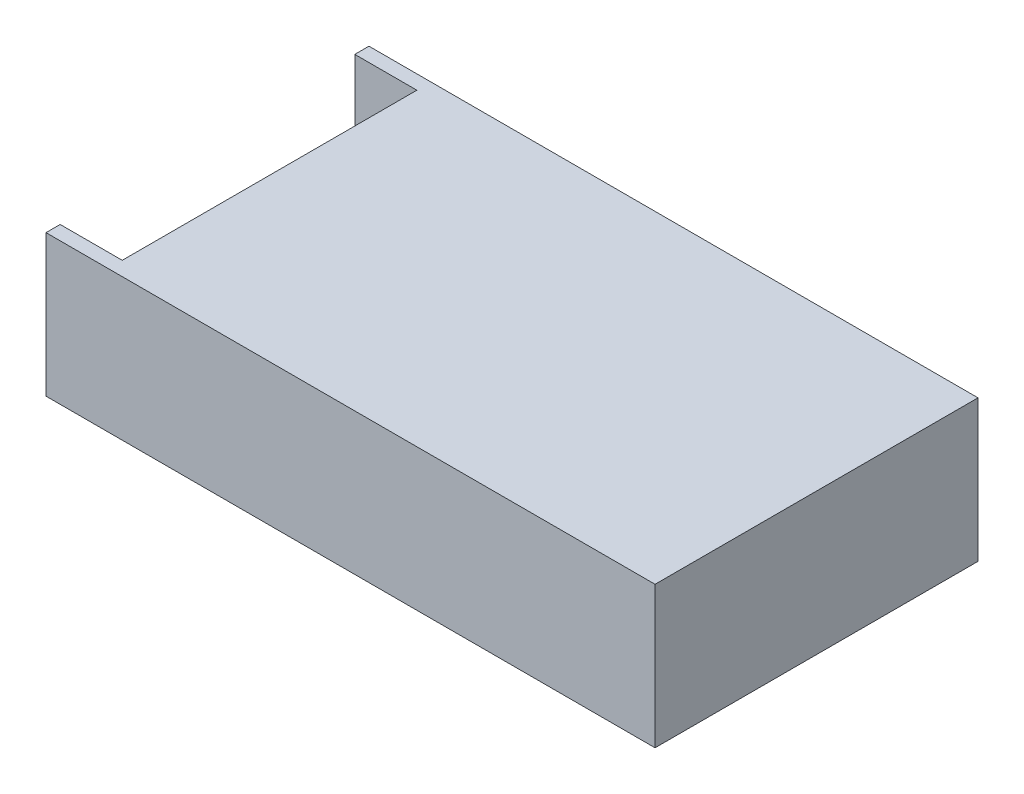
ISO-10303-21;
HEADER;
FILE_DESCRIPTION(('STEP AP214'),'2;1');
FILE_NAME('part.step','',(''),(''),'','','');
FILE_SCHEMA(('AUTOMOTIVE_DESIGN { 1 0 10303 214 1 1 1 1 }'));
ENDSEC;
DATA;
#1=APPLICATION_CONTEXT('core data for automotive mechanical design processes');
#2=APPLICATION_PROTOCOL_DEFINITION('international standard','automotive_design',2000,#1);
#3=PRODUCT_CONTEXT('',#1,'mechanical');
#4=PRODUCT('Part','Part','',(#3));
#5=PRODUCT_RELATED_PRODUCT_CATEGORY('part','',(#4));
#6=PRODUCT_DEFINITION_FORMATION('','',#4);
#7=PRODUCT_DEFINITION_CONTEXT('part definition',#1,'design');
#8=PRODUCT_DEFINITION('design','',#6,#7);
#9=PRODUCT_DEFINITION_SHAPE('','',#8);
#10=(LENGTH_UNIT() NAMED_UNIT(*) SI_UNIT(.MILLI.,.METRE.));
#11=(NAMED_UNIT(*) PLANE_ANGLE_UNIT() SI_UNIT($,.RADIAN.));
#12=(NAMED_UNIT(*) SI_UNIT($,.STERADIAN.) SOLID_ANGLE_UNIT());
#13=UNCERTAINTY_MEASURE_WITH_UNIT(LENGTH_MEASURE(1.E-05),#10,'distance_accuracy_value','');
#14=(GEOMETRIC_REPRESENTATION_CONTEXT(3) GLOBAL_UNCERTAINTY_ASSIGNED_CONTEXT((#13)) GLOBAL_UNIT_ASSIGNED_CONTEXT((#10,
#11,#12)) REPRESENTATION_CONTEXT('',''));
#15=CARTESIAN_POINT('',(0.,0.,0.));
#16=DIRECTION('',(0.,0.,1.));
#17=DIRECTION('',(1.,0.,0.));
#18=AXIS2_PLACEMENT_3D('',#15,#16,#17);
#19=CARTESIAN_POINT('',(-107.5,50.,-57.));
#20=DIRECTION('',(1.,0.,0.));
#21=DIRECTION('',(0.,0.,-1.));
#22=AXIS2_PLACEMENT_3D('',#19,#20,#21);
#23=PLANE('',#22);
#24=DIRECTION('',(0.,-1.,0.));
#25=VECTOR('',#24,1.);
#26=CARTESIAN_POINT('',(-107.5,6.42688909164235,52.));
#27=LINE('',#26,#25);
#28=CARTESIAN_POINT('',(-107.5,50.,52.));
#29=VERTEX_POINT('',#28);
#30=CARTESIAN_POINT('',(-107.5,6.42688909164235,52.));
#31=VERTEX_POINT('',#30);
#32=EDGE_CURVE('E140',#29,#31,#27,.T.);
#33=ORIENTED_EDGE('',*,*,#32,.T.);
#34=DIRECTION('',(0.,0.,1.));
#35=VECTOR('',#34,1.);
#36=CARTESIAN_POINT('',(-107.5,6.42688909164235,-105.773690868953));
#37=LINE('',#36,#35);
#38=CARTESIAN_POINT('',(-107.5,6.42688909164235,-52.));
#39=VERTEX_POINT('',#38);
#40=EDGE_CURVE('E122',#39,#31,#37,.T.);
#41=ORIENTED_EDGE('',*,*,#40,.F.);
#42=DIRECTION('',(0.,1.,0.));
#43=VECTOR('',#42,1.);
#44=CARTESIAN_POINT('',(-107.5,6.42688909164235,-52.));
#45=LINE('',#44,#43);
#46=CARTESIAN_POINT('',(-107.5,50.,-52.));
#47=VERTEX_POINT('',#46);
#48=EDGE_CURVE('E171',#39,#47,#45,.T.);
#49=ORIENTED_EDGE('',*,*,#48,.T.);
#50=DIRECTION('',(0.,0.,1.));
#51=VECTOR('',#50,1.);
#52=CARTESIAN_POINT('',(-107.5,50.,-57.));
#53=LINE('',#52,#51);
#54=CARTESIAN_POINT('',(-107.5,50.,-57.));
#55=VERTEX_POINT('',#54);
#56=EDGE_CURVE('E177',#55,#47,#53,.T.);
#57=ORIENTED_EDGE('',*,*,#56,.F.);
#58=DIRECTION('',(0.,-1.,0.));
#59=VECTOR('',#58,1.);
#60=CARTESIAN_POINT('',(-107.5,50.,-57.));
#61=LINE('',#60,#59);
#62=CARTESIAN_POINT('',(-107.5,0.,-57.));
#63=VERTEX_POINT('',#62);
#64=EDGE_CURVE('E44',#55,#63,#61,.T.);
#65=ORIENTED_EDGE('',*,*,#64,.T.);
#66=DIRECTION('',(0.,0.,1.));
#67=VECTOR('',#66,1.);
#68=CARTESIAN_POINT('',(-107.5,0.,-57.));
#69=LINE('',#68,#67);
#70=CARTESIAN_POINT('',(-107.5,0.,57.));
#71=VERTEX_POINT('',#70);
#72=EDGE_CURVE('E186',#63,#71,#69,.T.);
#73=ORIENTED_EDGE('',*,*,#72,.T.);
#74=DIRECTION('',(0.,-1.,0.));
#75=VECTOR('',#74,1.);
#76=CARTESIAN_POINT('',(-107.5,50.,57.));
#77=LINE('',#76,#75);
#78=CARTESIAN_POINT('',(-107.5,50.,57.));
#79=VERTEX_POINT('',#78);
#80=EDGE_CURVE('E190',#79,#71,#77,.T.);
#81=ORIENTED_EDGE('',*,*,#80,.F.);
#82=EDGE_CURVE('E148',#29,#79,#53,.T.);
#83=ORIENTED_EDGE('',*,*,#82,.F.);
#84=EDGE_LOOP('',(#33,#41,#49,#57,#65,#73,#81,#83));
#85=FACE_BOUND('',#84,.T.);
#86=ADVANCED_FACE('F36',(#85),#23,.F.);
#87=CARTESIAN_POINT('',(0.,50.,0.));
#88=DIRECTION('',(0.,1.,0.));
#89=DIRECTION('',(0.,0.,1.));
#90=AXIS2_PLACEMENT_3D('',#87,#88,#89);
#91=PLANE('',#90);
#92=DIRECTION('',(0.,0.,1.));
#93=VECTOR('',#92,1.);
#94=CARTESIAN_POINT('',(-85.5852349602344,50.,-105.773690868953));
#95=LINE('',#94,#93);
#96=CARTESIAN_POINT('',(-85.5852349602344,50.,-52.));
#97=VERTEX_POINT('',#96);
#98=CARTESIAN_POINT('',(-85.5852349602344,50.,52.));
#99=VERTEX_POINT('',#98);
#100=EDGE_CURVE('E51',#97,#99,#95,.T.);
#101=ORIENTED_EDGE('',*,*,#100,.T.);
#102=DIRECTION('',(-1.,0.,0.));
#103=VECTOR('',#102,1.);
#104=CARTESIAN_POINT('',(-107.5,50.,52.));
#105=LINE('',#104,#103);
#106=EDGE_CURVE('E134',#99,#29,#105,.T.);
#107=ORIENTED_EDGE('',*,*,#106,.T.);
#108=ORIENTED_EDGE('',*,*,#82,.T.);
#109=DIRECTION('',(1.,0.,0.));
#110=VECTOR('',#109,1.);
#111=CARTESIAN_POINT('',(-107.5,50.,57.));
#112=LINE('',#111,#110);
#113=CARTESIAN_POINT('',(107.5,50.,57.));
#114=VERTEX_POINT('',#113);
#115=EDGE_CURVE('E60',#79,#114,#112,.T.);
#116=ORIENTED_EDGE('',*,*,#115,.T.);
#117=DIRECTION('',(0.,0.,-1.));
#118=VECTOR('',#117,1.);
#119=CARTESIAN_POINT('',(107.5,50.,-57.));
#120=LINE('',#119,#118);
#121=CARTESIAN_POINT('',(107.5,50.,-57.));
#122=VERTEX_POINT('',#121);
#123=EDGE_CURVE('E174',#114,#122,#120,.T.);
#124=ORIENTED_EDGE('',*,*,#123,.T.);
#125=DIRECTION('',(-1.,0.,0.));
#126=VECTOR('',#125,1.);
#127=CARTESIAN_POINT('',(-107.5,50.,-57.));
#128=LINE('',#127,#126);
#129=EDGE_CURVE('E88',#122,#55,#128,.T.);
#130=ORIENTED_EDGE('',*,*,#129,.T.);
#131=ORIENTED_EDGE('',*,*,#56,.T.);
#132=DIRECTION('',(1.,0.,0.));
#133=VECTOR('',#132,1.);
#134=CARTESIAN_POINT('',(-107.5,50.,-52.));
#135=LINE('',#134,#133);
#136=EDGE_CURVE('E155',#47,#97,#135,.T.);
#137=ORIENTED_EDGE('',*,*,#136,.T.);
#138=EDGE_LOOP('',(#101,#107,#108,#116,#124,#130,#131,#137));
#139=FACE_BOUND('',#138,.T.);
#140=ADVANCED_FACE('F214',(#139),#91,.T.);
#141=CARTESIAN_POINT('',(107.5,50.,-57.));
#142=DIRECTION('',(-1.,0.,0.));
#143=DIRECTION('',(0.,0.,1.));
#144=AXIS2_PLACEMENT_3D('',#141,#142,#143);
#145=PLANE('',#144);
#146=DIRECTION('',(0.,0.,-1.));
#147=VECTOR('',#146,1.);
#148=CARTESIAN_POINT('',(107.5,0.,-57.));
#149=LINE('',#148,#147);
#150=CARTESIAN_POINT('',(107.5,0.,57.));
#151=VERTEX_POINT('',#150);
#152=CARTESIAN_POINT('',(107.5,0.,-57.));
#153=VERTEX_POINT('',#152);
#154=EDGE_CURVE('E173',#151,#153,#149,.T.);
#155=ORIENTED_EDGE('',*,*,#154,.T.);
#156=DIRECTION('',(0.,-1.,0.));
#157=VECTOR('',#156,1.);
#158=CARTESIAN_POINT('',(107.5,50.,-57.));
#159=LINE('',#158,#157);
#160=EDGE_CURVE('E12',#122,#153,#159,.T.);
#161=ORIENTED_EDGE('',*,*,#160,.F.);
#162=ORIENTED_EDGE('',*,*,#123,.F.);
#163=DIRECTION('',(0.,-1.,0.));
#164=VECTOR('',#163,1.);
#165=CARTESIAN_POINT('',(107.5,50.,57.));
#166=LINE('',#165,#164);
#167=EDGE_CURVE('E181',#114,#151,#166,.T.);
#168=ORIENTED_EDGE('',*,*,#167,.T.);
#169=EDGE_LOOP('',(#155,#161,#162,#168));
#170=FACE_BOUND('',#169,.T.);
#171=ADVANCED_FACE('F38',(#170),#145,.F.);
#172=CARTESIAN_POINT('',(-107.5,50.,-57.));
#173=DIRECTION('',(0.,0.,1.));
#174=DIRECTION('',(1.,0.,0.));
#175=AXIS2_PLACEMENT_3D('',#172,#173,#174);
#176=PLANE('',#175);
#177=DIRECTION('',(-1.,0.,0.));
#178=VECTOR('',#177,1.);
#179=CARTESIAN_POINT('',(-107.5,0.,-57.));
#180=LINE('',#179,#178);
#181=EDGE_CURVE('E184',#153,#63,#180,.T.);
#182=ORIENTED_EDGE('',*,*,#181,.T.);
#183=ORIENTED_EDGE('',*,*,#64,.F.);
#184=ORIENTED_EDGE('',*,*,#129,.F.);
#185=ORIENTED_EDGE('',*,*,#160,.T.);
#186=EDGE_LOOP('',(#182,#183,#184,#185));
#187=FACE_BOUND('',#186,.T.);
#188=ADVANCED_FACE('F202',(#187),#176,.F.);
#189=CARTESIAN_POINT('',(-107.5,50.,57.));
#190=DIRECTION('',(0.,0.,-1.));
#191=DIRECTION('',(-1.,0.,0.));
#192=AXIS2_PLACEMENT_3D('',#189,#190,#191);
#193=PLANE('',#192);
#194=DIRECTION('',(1.,0.,0.));
#195=VECTOR('',#194,1.);
#196=CARTESIAN_POINT('',(-107.5,0.,57.));
#197=LINE('',#196,#195);
#198=EDGE_CURVE('E81',#71,#151,#197,.T.);
#199=ORIENTED_EDGE('',*,*,#198,.T.);
#200=ORIENTED_EDGE('',*,*,#167,.F.);
#201=ORIENTED_EDGE('',*,*,#115,.F.);
#202=ORIENTED_EDGE('',*,*,#80,.T.);
#203=EDGE_LOOP('',(#199,#200,#201,#202));
#204=FACE_BOUND('',#203,.T.);
#205=ADVANCED_FACE('F200',(#204),#193,.F.);
#206=CARTESIAN_POINT('',(0.,0.,0.));
#207=DIRECTION('',(0.,1.,0.));
#208=DIRECTION('',(0.,0.,1.));
#209=AXIS2_PLACEMENT_3D('',#206,#207,#208);
#210=PLANE('',#209);
#211=CARTESIAN_POINT('',(-29.6,0.,42.));
#212=DIRECTION('',(0.,-1.,0.));
#213=DIRECTION('',(0.,0.,-1.));
#214=AXIS2_PLACEMENT_3D('',#211,#212,#213);
#215=CIRCLE('',#214,2.);
#216=CARTESIAN_POINT('',(-29.6,0.,40.));
#217=VERTEX_POINT('',#216);
#218=EDGE_CURVE('E277',#217,#217,#215,.T.);
#219=ORIENTED_EDGE('',*,*,#218,.F.);
#220=EDGE_LOOP('',(#219));
#221=FACE_BOUND('',#220,.T.);
#222=CARTESIAN_POINT('',(-29.6,0.,-43.));
#223=DIRECTION('',(0.,-1.,0.));
#224=DIRECTION('',(0.,0.,-1.));
#225=AXIS2_PLACEMENT_3D('',#222,#223,#224);
#226=CIRCLE('',#225,2.);
#227=CARTESIAN_POINT('',(-29.6,0.,-45.));
#228=VERTEX_POINT('',#227);
#229=EDGE_CURVE('E287',#228,#228,#226,.T.);
#230=ORIENTED_EDGE('',*,*,#229,.F.);
#231=EDGE_LOOP('',(#230));
#232=FACE_BOUND('',#231,.T.);
#233=CARTESIAN_POINT('',(96.,0.,-43.));
#234=DIRECTION('',(0.,-1.,0.));
#235=DIRECTION('',(0.,0.,-1.));
#236=AXIS2_PLACEMENT_3D('',#233,#234,#235);
#237=CIRCLE('',#236,2.);
#238=CARTESIAN_POINT('',(96.,0.,-45.));
#239=VERTEX_POINT('',#238);
#240=EDGE_CURVE('E293',#239,#239,#237,.T.);
#241=ORIENTED_EDGE('',*,*,#240,.F.);
#242=EDGE_LOOP('',(#241));
#243=FACE_BOUND('',#242,.T.);
#244=CARTESIAN_POINT('',(96.,0.,42.));
#245=DIRECTION('',(0.,-1.,0.));
#246=DIRECTION('',(0.,0.,-1.));
#247=AXIS2_PLACEMENT_3D('',#244,#245,#246);
#248=CIRCLE('',#247,2.);
#249=CARTESIAN_POINT('',(96.,0.,40.));
#250=VERTEX_POINT('',#249);
#251=EDGE_CURVE('E152',#250,#250,#248,.T.);
#252=ORIENTED_EDGE('',*,*,#251,.F.);
#253=EDGE_LOOP('',(#252));
#254=FACE_BOUND('',#253,.T.);
#255=ORIENTED_EDGE('',*,*,#154,.F.);
#256=ORIENTED_EDGE('',*,*,#198,.F.);
#257=ORIENTED_EDGE('',*,*,#72,.F.);
#258=ORIENTED_EDGE('',*,*,#181,.F.);
#259=EDGE_LOOP('',(#255,#256,#257,#258));
#260=FACE_BOUND('',#259,.T.);
#261=ADVANCED_FACE('F196',(#221,#232,#243,#254,#260),#210,.F.);
#262=CARTESIAN_POINT('',(-85.5852349602344,50.,-105.773690868953));
#263=DIRECTION('',(1.,0.,0.));
#264=DIRECTION('',(0.,0.,-1.));
#265=AXIS2_PLACEMENT_3D('',#262,#263,#264);
#266=PLANE('',#265);
#267=DIRECTION('',(0.,-1.,0.));
#268=VECTOR('',#267,1.);
#269=CARTESIAN_POINT('',(-85.5852349602344,50.,-52.));
#270=LINE('',#269,#268);
#271=CARTESIAN_POINT('',(-85.5852349602344,16.1338908097548,-52.));
#272=VERTEX_POINT('',#271);
#273=EDGE_CURVE('E300',#97,#272,#270,.T.);
#274=ORIENTED_EDGE('',*,*,#273,.T.);
#275=DIRECTION('',(0.,0.,1.));
#276=VECTOR('',#275,1.);
#277=CARTESIAN_POINT('',(-85.5852349602344,16.1338908097548,-105.773690868953));
#278=LINE('',#277,#276);
#279=CARTESIAN_POINT('',(-85.5852349602344,16.1338908097548,52.));
#280=VERTEX_POINT('',#279);
#281=EDGE_CURVE('E166',#272,#280,#278,.T.);
#282=ORIENTED_EDGE('',*,*,#281,.T.);
#283=DIRECTION('',(0.,1.,0.));
#284=VECTOR('',#283,1.);
#285=CARTESIAN_POINT('',(-85.5852349602344,50.,52.));
#286=LINE('',#285,#284);
#287=EDGE_CURVE('E162',#280,#99,#286,.T.);
#288=ORIENTED_EDGE('',*,*,#287,.T.);
#289=ORIENTED_EDGE('',*,*,#100,.F.);
#290=EDGE_LOOP('',(#274,#282,#288,#289));
#291=FACE_BOUND('',#290,.T.);
#292=ADVANCED_FACE('F209',(#291),#266,.F.);
#293=CARTESIAN_POINT('',(-102.483117777339,16.1338908097548,-105.773690868953));
#294=DIRECTION('',(0.,-1.,0.));
#295=DIRECTION('',(0.,0.,-1.));
#296=AXIS2_PLACEMENT_3D('',#293,#294,#295);
#297=PLANE('',#296);
#298=DIRECTION('',(-1.,0.,0.));
#299=VECTOR('',#298,1.);
#300=CARTESIAN_POINT('',(-102.483117777339,16.1338908097548,-52.));
#301=LINE('',#300,#299);
#302=CARTESIAN_POINT('',(-102.483117777339,16.1338908097548,-52.));
#303=VERTEX_POINT('',#302);
#304=EDGE_CURVE('E299',#272,#303,#301,.T.);
#305=ORIENTED_EDGE('',*,*,#304,.T.);
#306=DIRECTION('',(0.,0.,1.));
#307=VECTOR('',#306,1.);
#308=CARTESIAN_POINT('',(-102.483117777339,16.1338908097548,-105.773690868953));
#309=LINE('',#308,#307);
#310=CARTESIAN_POINT('',(-102.483117777339,16.1338908097548,52.));
#311=VERTEX_POINT('',#310);
#312=EDGE_CURVE('E168',#303,#311,#309,.T.);
#313=ORIENTED_EDGE('',*,*,#312,.T.);
#314=DIRECTION('',(1.,0.,0.));
#315=VECTOR('',#314,1.);
#316=CARTESIAN_POINT('',(-102.483117777339,16.1338908097548,52.));
#317=LINE('',#316,#315);
#318=EDGE_CURVE('E159',#311,#280,#317,.T.);
#319=ORIENTED_EDGE('',*,*,#318,.T.);
#320=ORIENTED_EDGE('',*,*,#281,.F.);
#321=EDGE_LOOP('',(#305,#313,#319,#320));
#322=FACE_BOUND('',#321,.T.);
#323=ADVANCED_FACE('F228',(#322),#297,.F.);
#324=CARTESIAN_POINT('',(-102.483117777339,6.42688909164235,-105.773690868953));
#325=DIRECTION('',(1.,0.,0.));
#326=DIRECTION('',(0.,0.,-1.));
#327=AXIS2_PLACEMENT_3D('',#324,#325,#326);
#328=PLANE('',#327);
#329=DIRECTION('',(0.,-1.,0.));
#330=VECTOR('',#329,1.);
#331=CARTESIAN_POINT('',(-102.483117777339,6.42688909164235,-52.));
#332=LINE('',#331,#330);
#333=CARTESIAN_POINT('',(-102.483117777339,6.42688909164235,-52.));
#334=VERTEX_POINT('',#333);
#335=EDGE_CURVE('E297',#303,#334,#332,.T.);
#336=ORIENTED_EDGE('',*,*,#335,.T.);
#337=DIRECTION('',(0.,0.,1.));
#338=VECTOR('',#337,1.);
#339=CARTESIAN_POINT('',(-102.483117777339,6.42688909164235,-105.773690868953));
#340=LINE('',#339,#338);
#341=CARTESIAN_POINT('',(-102.483117777339,6.42688909164235,52.));
#342=VERTEX_POINT('',#341);
#343=EDGE_CURVE('E133',#334,#342,#340,.T.);
#344=ORIENTED_EDGE('',*,*,#343,.T.);
#345=DIRECTION('',(0.,1.,0.));
#346=VECTOR('',#345,1.);
#347=CARTESIAN_POINT('',(-102.483117777339,6.42688909164235,52.));
#348=LINE('',#347,#346);
#349=EDGE_CURVE('E144',#342,#311,#348,.T.);
#350=ORIENTED_EDGE('',*,*,#349,.T.);
#351=ORIENTED_EDGE('',*,*,#312,.F.);
#352=EDGE_LOOP('',(#336,#344,#350,#351));
#353=FACE_BOUND('',#352,.T.);
#354=ADVANCED_FACE('F225',(#353),#328,.F.);
#355=CARTESIAN_POINT('',(-102.483117777339,6.42688909164235,-105.773690868953));
#356=DIRECTION('',(0.,-1.,0.));
#357=DIRECTION('',(0.,0.,-1.));
#358=AXIS2_PLACEMENT_3D('',#355,#356,#357);
#359=PLANE('',#358);
#360=DIRECTION('',(-1.,0.,0.));
#361=VECTOR('',#360,1.);
#362=CARTESIAN_POINT('',(-102.483117777339,6.42688909164235,-52.));
#363=LINE('',#362,#361);
#364=EDGE_CURVE('E128',#334,#39,#363,.T.);
#365=ORIENTED_EDGE('',*,*,#364,.T.);
#366=ORIENTED_EDGE('',*,*,#40,.T.);
#367=DIRECTION('',(1.,0.,0.));
#368=VECTOR('',#367,1.);
#369=CARTESIAN_POINT('',(-102.483117777339,6.42688909164235,52.));
#370=LINE('',#369,#368);
#371=EDGE_CURVE('E126',#31,#342,#370,.T.);
#372=ORIENTED_EDGE('',*,*,#371,.T.);
#373=ORIENTED_EDGE('',*,*,#343,.F.);
#374=EDGE_LOOP('',(#365,#366,#372,#373));
#375=FACE_BOUND('',#374,.T.);
#376=ADVANCED_FACE('F124',(#375),#359,.F.);
#377=CARTESIAN_POINT('',(0.,0.,52.));
#378=DIRECTION('',(0.,0.,-1.));
#379=DIRECTION('',(-1.,0.,0.));
#380=AXIS2_PLACEMENT_3D('',#377,#378,#379);
#381=PLANE('',#380);
#382=ORIENTED_EDGE('',*,*,#106,.F.);
#383=ORIENTED_EDGE('',*,*,#287,.F.);
#384=ORIENTED_EDGE('',*,*,#318,.F.);
#385=ORIENTED_EDGE('',*,*,#349,.F.);
#386=ORIENTED_EDGE('',*,*,#371,.F.);
#387=ORIENTED_EDGE('',*,*,#32,.F.);
#388=EDGE_LOOP('',(#382,#383,#384,#385,#386,#387));
#389=FACE_BOUND('',#388,.T.);
#390=ADVANCED_FACE('F139',(#389),#381,.T.);
#391=CARTESIAN_POINT('',(-107.5,50.,-52.));
#392=DIRECTION('',(0.,0.,1.));
#393=DIRECTION('',(1.,0.,0.));
#394=AXIS2_PLACEMENT_3D('',#391,#392,#393);
#395=PLANE('',#394);
#396=ORIENTED_EDGE('',*,*,#136,.F.);
#397=ORIENTED_EDGE('',*,*,#48,.F.);
#398=ORIENTED_EDGE('',*,*,#364,.F.);
#399=ORIENTED_EDGE('',*,*,#335,.F.);
#400=ORIENTED_EDGE('',*,*,#304,.F.);
#401=ORIENTED_EDGE('',*,*,#273,.F.);
#402=EDGE_LOOP('',(#396,#397,#398,#399,#400,#401));
#403=FACE_BOUND('',#402,.T.);
#404=ADVANCED_FACE('F237',(#403),#395,.T.);
#405=CARTESIAN_POINT('',(96.,10.,42.));
#406=DIRECTION('',(0.,-1.,0.));
#407=DIRECTION('',(0.,0.,-1.));
#408=AXIS2_PLACEMENT_3D('',#405,#406,#407);
#409=CYLINDRICAL_SURFACE('',#408,2.);
#410=CARTESIAN_POINT('',(96.,10.,42.));
#411=DIRECTION('',(0.,-1.,0.));
#412=DIRECTION('',(0.,0.,-1.));
#413=AXIS2_PLACEMENT_3D('',#410,#411,#412);
#414=CIRCLE('',#413,2.);
#415=CARTESIAN_POINT('',(96.,10.,40.));
#416=VERTEX_POINT('',#415);
#417=EDGE_CURVE('E149',#416,#416,#414,.T.);
#418=ORIENTED_EDGE('',*,*,#417,.F.);
#419=EDGE_LOOP('',(#418));
#420=FACE_BOUND('',#419,.T.);
#421=ORIENTED_EDGE('',*,*,#251,.T.);
#422=EDGE_LOOP('',(#421));
#423=FACE_BOUND('',#422,.T.);
#424=ADVANCED_FACE('F240',(#420,#423),#409,.F.);
#425=CARTESIAN_POINT('',(96.,10.,42.));
#426=DIRECTION('',(0.,-1.,0.));
#427=DIRECTION('',(0.,0.,-1.));
#428=AXIS2_PLACEMENT_3D('',#425,#426,#427);
#429=PLANE('',#428);
#430=ORIENTED_EDGE('',*,*,#417,.T.);
#431=EDGE_LOOP('',(#430));
#432=FACE_BOUND('',#431,.T.);
#433=ADVANCED_FACE('F244',(#432),#429,.T.);
#434=CARTESIAN_POINT('',(96.,10.,-43.));
#435=DIRECTION('',(0.,-1.,0.));
#436=DIRECTION('',(0.,0.,-1.));
#437=AXIS2_PLACEMENT_3D('',#434,#435,#436);
#438=CYLINDRICAL_SURFACE('',#437,2.);
#439=CARTESIAN_POINT('',(96.,10.,-43.));
#440=DIRECTION('',(0.,-1.,0.));
#441=DIRECTION('',(0.,0.,-1.));
#442=AXIS2_PLACEMENT_3D('',#439,#440,#441);
#443=CIRCLE('',#442,2.);
#444=CARTESIAN_POINT('',(96.,10.,-45.));
#445=VERTEX_POINT('',#444);
#446=EDGE_CURVE('E290',#445,#445,#443,.T.);
#447=ORIENTED_EDGE('',*,*,#446,.F.);
#448=EDGE_LOOP('',(#447));
#449=FACE_BOUND('',#448,.T.);
#450=ORIENTED_EDGE('',*,*,#240,.T.);
#451=EDGE_LOOP('',(#450));
#452=FACE_BOUND('',#451,.T.);
#453=ADVANCED_FACE('F248',(#449,#452),#438,.F.);
#454=CARTESIAN_POINT('',(96.,10.,-43.));
#455=DIRECTION('',(0.,-1.,0.));
#456=DIRECTION('',(0.,0.,-1.));
#457=AXIS2_PLACEMENT_3D('',#454,#455,#456);
#458=PLANE('',#457);
#459=ORIENTED_EDGE('',*,*,#446,.T.);
#460=EDGE_LOOP('',(#459));
#461=FACE_BOUND('',#460,.T.);
#462=ADVANCED_FACE('F252',(#461),#458,.T.);
#463=CARTESIAN_POINT('',(-29.6,10.,-43.));
#464=DIRECTION('',(0.,-1.,0.));
#465=DIRECTION('',(0.,0.,-1.));
#466=AXIS2_PLACEMENT_3D('',#463,#464,#465);
#467=CYLINDRICAL_SURFACE('',#466,2.);
#468=CARTESIAN_POINT('',(-29.6,10.,-43.));
#469=DIRECTION('',(0.,-1.,0.));
#470=DIRECTION('',(0.,0.,-1.));
#471=AXIS2_PLACEMENT_3D('',#468,#469,#470);
#472=CIRCLE('',#471,2.);
#473=CARTESIAN_POINT('',(-29.6,10.,-45.));
#474=VERTEX_POINT('',#473);
#475=EDGE_CURVE('E282',#474,#474,#472,.T.);
#476=ORIENTED_EDGE('',*,*,#475,.F.);
#477=EDGE_LOOP('',(#476));
#478=FACE_BOUND('',#477,.T.);
#479=ORIENTED_EDGE('',*,*,#229,.T.);
#480=EDGE_LOOP('',(#479));
#481=FACE_BOUND('',#480,.T.);
#482=ADVANCED_FACE('F256',(#478,#481),#467,.F.);
#483=CARTESIAN_POINT('',(-29.6,10.,-43.));
#484=DIRECTION('',(0.,-1.,0.));
#485=DIRECTION('',(0.,0.,-1.));
#486=AXIS2_PLACEMENT_3D('',#483,#484,#485);
#487=PLANE('',#486);
#488=ORIENTED_EDGE('',*,*,#475,.T.);
#489=EDGE_LOOP('',(#488));
#490=FACE_BOUND('',#489,.T.);
#491=ADVANCED_FACE('F260',(#490),#487,.T.);
#492=CARTESIAN_POINT('',(-29.6,10.,42.));
#493=DIRECTION('',(0.,-1.,0.));
#494=DIRECTION('',(0.,0.,-1.));
#495=AXIS2_PLACEMENT_3D('',#492,#493,#494);
#496=CYLINDRICAL_SURFACE('',#495,2.);
#497=CARTESIAN_POINT('',(-29.6,10.,42.));
#498=DIRECTION('',(0.,-1.,0.));
#499=DIRECTION('',(0.,0.,-1.));
#500=AXIS2_PLACEMENT_3D('',#497,#498,#499);
#501=CIRCLE('',#500,2.);
#502=CARTESIAN_POINT('',(-29.6,10.,40.));
#503=VERTEX_POINT('',#502);
#504=EDGE_CURVE('E276',#503,#503,#501,.T.);
#505=ORIENTED_EDGE('',*,*,#504,.F.);
#506=EDGE_LOOP('',(#505));
#507=FACE_BOUND('',#506,.T.);
#508=ORIENTED_EDGE('',*,*,#218,.T.);
#509=EDGE_LOOP('',(#508));
#510=FACE_BOUND('',#509,.T.);
#511=ADVANCED_FACE('F264',(#507,#510),#496,.F.);
#512=CARTESIAN_POINT('',(-29.6,10.,42.));
#513=DIRECTION('',(0.,-1.,0.));
#514=DIRECTION('',(0.,0.,-1.));
#515=AXIS2_PLACEMENT_3D('',#512,#513,#514);
#516=PLANE('',#515);
#517=ORIENTED_EDGE('',*,*,#504,.T.);
#518=EDGE_LOOP('',(#517));
#519=FACE_BOUND('',#518,.T.);
#520=ADVANCED_FACE('F268',(#519),#516,.T.);
#521=CLOSED_SHELL('',(#86,#140,#171,#188,#205,#261,#292,#323,#354,#376,#390,#404,#424,#433,#453,
#462,#482,#491,#511,#520));
#522=MANIFOLD_SOLID_BREP('B2',#521);
#523=ADVANCED_BREP_SHAPE_REPRESENTATION('',(#18,#522),#14);
#524=SHAPE_DEFINITION_REPRESENTATION(#9,#523);
ENDSEC;
END-ISO-10303-21;
